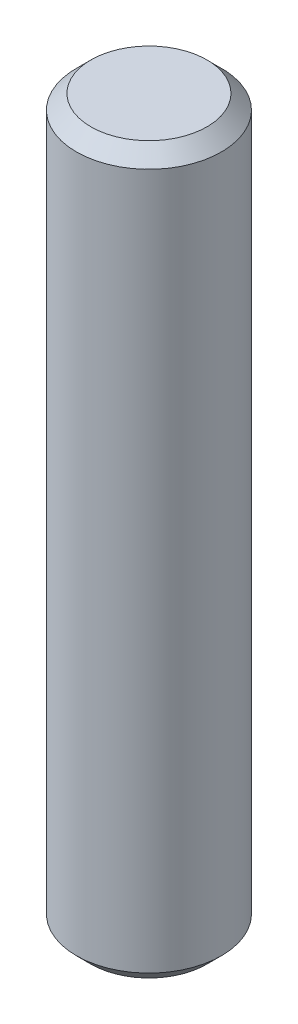
ISO-10303-21;
HEADER;
FILE_DESCRIPTION(('STEP AP214'),'2;1');
FILE_NAME('part.step','',(''),(''),'','','');
FILE_SCHEMA(('AUTOMOTIVE_DESIGN { 1 0 10303 214 1 1 1 1 }'));
ENDSEC;
DATA;
#1=APPLICATION_CONTEXT('core data for automotive mechanical design processes');
#2=APPLICATION_PROTOCOL_DEFINITION('international standard','automotive_design',2000,#1);
#3=PRODUCT_CONTEXT('',#1,'mechanical');
#4=PRODUCT('Part','Part','',(#3));
#5=PRODUCT_RELATED_PRODUCT_CATEGORY('part','',(#4));
#6=PRODUCT_DEFINITION_FORMATION('','',#4);
#7=PRODUCT_DEFINITION_CONTEXT('part definition',#1,'design');
#8=PRODUCT_DEFINITION('design','',#6,#7);
#9=PRODUCT_DEFINITION_SHAPE('','',#8);
#10=(LENGTH_UNIT() NAMED_UNIT(*) SI_UNIT(.MILLI.,.METRE.));
#11=(NAMED_UNIT(*) PLANE_ANGLE_UNIT() SI_UNIT($,.RADIAN.));
#12=(NAMED_UNIT(*) SI_UNIT($,.STERADIAN.) SOLID_ANGLE_UNIT());
#13=UNCERTAINTY_MEASURE_WITH_UNIT(LENGTH_MEASURE(1.E-05),#10,'distance_accuracy_value','');
#14=(GEOMETRIC_REPRESENTATION_CONTEXT(3) GLOBAL_UNCERTAINTY_ASSIGNED_CONTEXT((#13)) GLOBAL_UNIT_ASSIGNED_CONTEXT((#10,
#11,#12)) REPRESENTATION_CONTEXT('',''));
#15=CARTESIAN_POINT('',(0.,0.,0.));
#16=DIRECTION('',(0.,0.,1.));
#17=DIRECTION('',(1.,0.,0.));
#18=AXIS2_PLACEMENT_3D('',#15,#16,#17);
#19=CARTESIAN_POINT('',(0.,50.,0.));
#20=DIRECTION('',(0.,-1.,0.));
#21=DIRECTION('',(0.,0.,-1.));
#22=AXIS2_PLACEMENT_3D('',#19,#20,#21);
#23=CYLINDRICAL_SURFACE('',#22,5.);
#24=CARTESIAN_POINT('',(0.,1.,0.));
#25=DIRECTION('',(0.,1.,0.));
#26=DIRECTION('',(0.,0.,1.));
#27=AXIS2_PLACEMENT_3D('',#24,#25,#26);
#28=CIRCLE('',#27,5.);
#29=CARTESIAN_POINT('',(0.,1.,5.));
#30=VERTEX_POINT('',#29);
#31=EDGE_CURVE('E49',#30,#30,#28,.T.);
#32=ORIENTED_EDGE('',*,*,#31,.T.);
#33=EDGE_LOOP('',(#32));
#34=FACE_BOUND('',#33,.T.);
#35=CARTESIAN_POINT('',(0.,49.,0.));
#36=DIRECTION('',(0.,1.,0.));
#37=DIRECTION('',(0.,0.,1.));
#38=AXIS2_PLACEMENT_3D('',#35,#36,#37);
#39=CIRCLE('',#38,5.);
#40=CARTESIAN_POINT('',(0.,49.,5.));
#41=VERTEX_POINT('',#40);
#42=EDGE_CURVE('E53',#41,#41,#39,.F.);
#43=ORIENTED_EDGE('',*,*,#42,.T.);
#44=EDGE_LOOP('',(#43));
#45=FACE_BOUND('',#44,.T.);
#46=ADVANCED_FACE('F37',(#34,#45),#23,.T.);
#47=CARTESIAN_POINT('',(0.,50.,0.));
#48=DIRECTION('',(0.,1.,0.));
#49=DIRECTION('',(0.,0.,1.));
#50=AXIS2_PLACEMENT_3D('',#47,#48,#49);
#51=PLANE('',#50);
#52=CARTESIAN_POINT('',(0.,50.,0.));
#53=DIRECTION('',(0.,1.,0.));
#54=DIRECTION('',(0.,0.,1.));
#55=AXIS2_PLACEMENT_3D('',#52,#53,#54);
#56=CIRCLE('',#55,3.99999999999999);
#57=CARTESIAN_POINT('',(0.,50.,3.99999999999999));
#58=VERTEX_POINT('',#57);
#59=EDGE_CURVE('E10',#58,#58,#56,.T.);
#60=ORIENTED_EDGE('',*,*,#59,.T.);
#61=EDGE_LOOP('',(#60));
#62=FACE_BOUND('',#61,.T.);
#63=ADVANCED_FACE('F69',(#62),#51,.T.);
#64=CARTESIAN_POINT('',(0.,0.,0.));
#65=DIRECTION('',(0.,1.,0.));
#66=DIRECTION('',(0.,0.,1.));
#67=AXIS2_PLACEMENT_3D('',#64,#65,#66);
#68=PLANE('',#67);
#69=CARTESIAN_POINT('',(0.,0.,0.));
#70=DIRECTION('',(0.,1.,0.));
#71=DIRECTION('',(0.,0.,1.));
#72=AXIS2_PLACEMENT_3D('',#69,#70,#71);
#73=CIRCLE('',#72,3.99999999999999);
#74=CARTESIAN_POINT('',(0.,0.,3.99999999999999));
#75=VERTEX_POINT('',#74);
#76=EDGE_CURVE('E45',#75,#75,#73,.F.);
#77=ORIENTED_EDGE('',*,*,#76,.T.);
#78=EDGE_LOOP('',(#77));
#79=FACE_BOUND('',#78,.T.);
#80=ADVANCED_FACE('F66',(#79),#68,.F.);
#81=CARTESIAN_POINT('',(0.,1.,0.));
#82=DIRECTION('',(0.,1.,0.));
#83=DIRECTION('',(0.,0.,1.));
#84=AXIS2_PLACEMENT_3D('',#81,#82,#83);
#85=CONICAL_SURFACE('',#84,5.,0.785398163397453);
#86=ORIENTED_EDGE('',*,*,#76,.F.);
#87=EDGE_LOOP('',(#86));
#88=FACE_BOUND('',#87,.T.);
#89=ORIENTED_EDGE('',*,*,#31,.F.);
#90=EDGE_LOOP('',(#89));
#91=FACE_BOUND('',#90,.T.);
#92=ADVANCED_FACE('F62',(#88,#91),#85,.T.);
#93=CARTESIAN_POINT('',(0.,50.,0.));
#94=DIRECTION('',(0.,-1.,0.));
#95=DIRECTION('',(0.,0.,-1.));
#96=AXIS2_PLACEMENT_3D('',#93,#94,#95);
#97=CONICAL_SURFACE('',#96,3.99999999999999,0.785398163397446);
#98=ORIENTED_EDGE('',*,*,#42,.F.);
#99=EDGE_LOOP('',(#98));
#100=FACE_BOUND('',#99,.T.);
#101=ORIENTED_EDGE('',*,*,#59,.F.);
#102=EDGE_LOOP('',(#101));
#103=FACE_BOUND('',#102,.T.);
#104=ADVANCED_FACE('F40',(#100,#103),#97,.T.);
#105=CLOSED_SHELL('',(#46,#63,#80,#92,#104));
#106=MANIFOLD_SOLID_BREP('B2',#105);
#107=ADVANCED_BREP_SHAPE_REPRESENTATION('',(#18,#106),#14);
#108=SHAPE_DEFINITION_REPRESENTATION(#9,#107);
ENDSEC;
END-ISO-10303-21;
